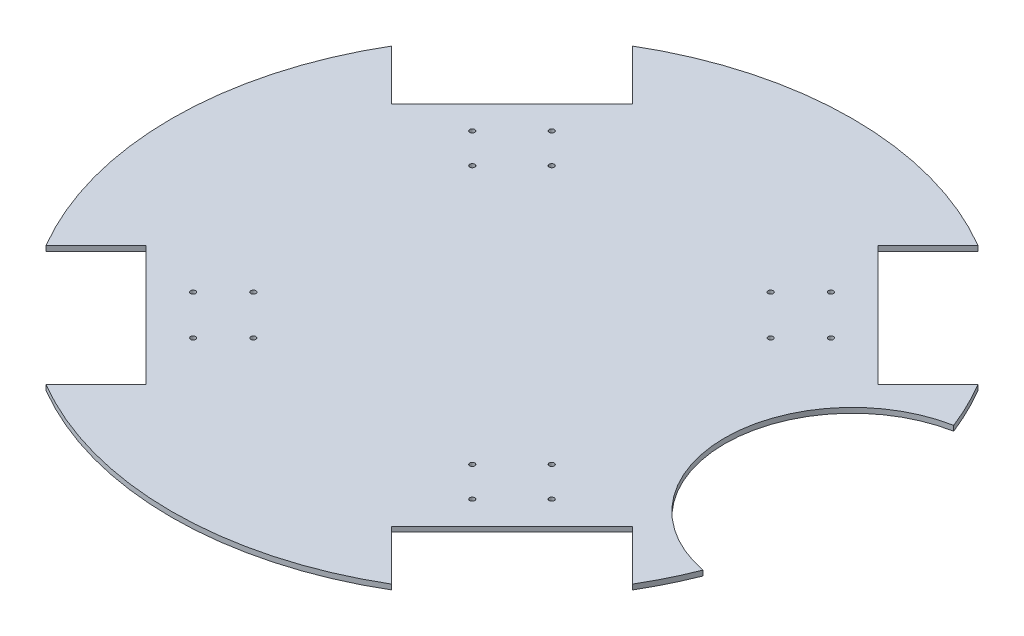
ISO-10303-21;
HEADER;
FILE_DESCRIPTION(('STEP AP214'),'2;1');
FILE_NAME('part.step','',(''),(''),'','','');
FILE_SCHEMA(('AUTOMOTIVE_DESIGN { 1 0 10303 214 1 1 1 1 }'));
ENDSEC;
DATA;
#1=APPLICATION_CONTEXT('core data for automotive mechanical design processes');
#2=APPLICATION_PROTOCOL_DEFINITION('international standard','automotive_design',2000,#1);
#3=PRODUCT_CONTEXT('',#1,'mechanical');
#4=PRODUCT('Part','Part','',(#3));
#5=PRODUCT_RELATED_PRODUCT_CATEGORY('part','',(#4));
#6=PRODUCT_DEFINITION_FORMATION('','',#4);
#7=PRODUCT_DEFINITION_CONTEXT('part definition',#1,'design');
#8=PRODUCT_DEFINITION('design','',#6,#7);
#9=PRODUCT_DEFINITION_SHAPE('','',#8);
#10=(LENGTH_UNIT() NAMED_UNIT(*) SI_UNIT(.MILLI.,.METRE.));
#11=(NAMED_UNIT(*) PLANE_ANGLE_UNIT() SI_UNIT($,.RADIAN.));
#12=(NAMED_UNIT(*) SI_UNIT($,.STERADIAN.) SOLID_ANGLE_UNIT());
#13=UNCERTAINTY_MEASURE_WITH_UNIT(LENGTH_MEASURE(1.E-05),#10,'distance_accuracy_value','');
#14=(GEOMETRIC_REPRESENTATION_CONTEXT(3) GLOBAL_UNCERTAINTY_ASSIGNED_CONTEXT((#13)) GLOBAL_UNIT_ASSIGNED_CONTEXT((#10,
#11,#12)) REPRESENTATION_CONTEXT('',''));
#15=CARTESIAN_POINT('',(0.,0.,0.));
#16=DIRECTION('',(0.,0.,1.));
#17=DIRECTION('',(1.,0.,0.));
#18=AXIS2_PLACEMENT_3D('',#15,#16,#17);
#19=CARTESIAN_POINT('',(0.,3.,0.));
#20=DIRECTION('',(0.,-1.,0.));
#21=DIRECTION('',(0.,0.,-1.));
#22=AXIS2_PLACEMENT_3D('',#19,#20,#21);
#23=CYLINDRICAL_SURFACE('',#22,200.);
#24=CARTESIAN_POINT('',(0.,0.,0.));
#25=DIRECTION('',(0.,1.,0.));
#26=DIRECTION('',(0.,0.,1.));
#27=AXIS2_PLACEMENT_3D('',#24,#25,#26);
#28=CIRCLE('',#27,200.);
#29=CARTESIAN_POINT('',(172.285978435621,0.,101.57530031696));
#30=VERTEX_POINT('',#29);
#31=CARTESIAN_POINT('',(185.9375,0.,73.6698452132894));
#32=VERTEX_POINT('',#31);
#33=EDGE_CURVE('E204',#30,#32,#28,.T.);
#34=ORIENTED_EDGE('',*,*,#33,.T.);
#35=DIRECTION('',(0.,1.,0.));
#36=VECTOR('',#35,1.);
#37=CARTESIAN_POINT('',(185.9375,-2.,73.6698452132893));
#38=LINE('',#37,#36);
#39=CARTESIAN_POINT('',(185.9375,3.,73.6698452132893));
#40=VERTEX_POINT('',#39);
#41=EDGE_CURVE('E57',#32,#40,#38,.T.);
#42=ORIENTED_EDGE('',*,*,#41,.T.);
#43=CARTESIAN_POINT('',(0.,3.,0.));
#44=DIRECTION('',(0.,1.,0.));
#45=DIRECTION('',(0.,0.,1.));
#46=AXIS2_PLACEMENT_3D('',#43,#44,#45);
#47=CIRCLE('',#46,200.);
#48=CARTESIAN_POINT('',(172.285978435621,3.,101.57530031696));
#49=VERTEX_POINT('',#48);
#50=EDGE_CURVE('E182',#49,#40,#47,.T.);
#51=ORIENTED_EDGE('',*,*,#50,.F.);
#52=DIRECTION('',(0.,-1.,0.));
#53=VECTOR('',#52,1.);
#54=CARTESIAN_POINT('',(172.285978435621,3.,101.57530031696));
#55=LINE('',#54,#53);
#56=EDGE_CURVE('E291',#49,#30,#55,.T.);
#57=ORIENTED_EDGE('',*,*,#56,.T.);
#58=EDGE_LOOP('',(#34,#42,#51,#57));
#59=FACE_BOUND('',#58,.T.);
#60=ADVANCED_FACE('F39',(#59),#23,.T.);
#61=CARTESIAN_POINT('',(-101.575300316964,0.,172.285978435619));
#62=VERTEX_POINT('',#61);
#63=CARTESIAN_POINT('',(101.575300316968,0.,172.285978435616));
#64=VERTEX_POINT('',#63);
#65=EDGE_CURVE('E211',#62,#64,#28,.T.);
#66=ORIENTED_EDGE('',*,*,#65,.T.);
#67=DIRECTION('',(0.,-1.,0.));
#68=VECTOR('',#67,1.);
#69=CARTESIAN_POINT('',(101.575300316968,3.,172.285978435616));
#70=LINE('',#69,#68);
#71=CARTESIAN_POINT('',(101.575300316968,3.,172.285978435616));
#72=VERTEX_POINT('',#71);
#73=EDGE_CURVE('E221',#64,#72,#70,.F.);
#74=ORIENTED_EDGE('',*,*,#73,.T.);
#75=CARTESIAN_POINT('',(-101.575300316964,3.,172.285978435619));
#76=VERTEX_POINT('',#75);
#77=EDGE_CURVE('E193',#76,#72,#47,.T.);
#78=ORIENTED_EDGE('',*,*,#77,.F.);
#79=DIRECTION('',(0.,-1.,0.));
#80=VECTOR('',#79,1.);
#81=CARTESIAN_POINT('',(-101.575300316964,3.,172.285978435619));
#82=LINE('',#81,#80);
#83=EDGE_CURVE('E272',#76,#62,#82,.T.);
#84=ORIENTED_EDGE('',*,*,#83,.T.);
#85=EDGE_LOOP('',(#66,#74,#78,#84));
#86=FACE_BOUND('',#85,.T.);
#87=ADVANCED_FACE('F296',(#86),#23,.T.);
#88=CARTESIAN_POINT('',(185.9375,3.,-73.6698452132893));
#89=VERTEX_POINT('',#88);
#90=CARTESIAN_POINT('',(172.285978435617,3.,-101.575300316968));
#91=VERTEX_POINT('',#90);
#92=EDGE_CURVE('E178',#89,#91,#47,.T.);
#93=ORIENTED_EDGE('',*,*,#92,.F.);
#94=DIRECTION('',(0.,1.,0.));
#95=VECTOR('',#94,1.);
#96=CARTESIAN_POINT('',(185.9375,-2.,-73.6698452132893));
#97=LINE('',#96,#95);
#98=CARTESIAN_POINT('',(185.9375,0.,-73.6698452132894));
#99=VERTEX_POINT('',#98);
#100=EDGE_CURVE('E165',#89,#99,#97,.F.);
#101=ORIENTED_EDGE('',*,*,#100,.T.);
#102=CARTESIAN_POINT('',(172.285978435617,0.,-101.575300316968));
#103=VERTEX_POINT('',#102);
#104=EDGE_CURVE('E210',#99,#103,#28,.T.);
#105=ORIENTED_EDGE('',*,*,#104,.T.);
#106=DIRECTION('',(0.,-1.,0.));
#107=VECTOR('',#106,1.);
#108=CARTESIAN_POINT('',(172.285978435616,3.,-101.575300316968));
#109=LINE('',#108,#107);
#110=EDGE_CURVE('E188',#103,#91,#109,.F.);
#111=ORIENTED_EDGE('',*,*,#110,.T.);
#112=EDGE_LOOP('',(#93,#101,#105,#111));
#113=FACE_BOUND('',#112,.T.);
#114=ADVANCED_FACE('F186',(#113),#23,.T.);
#115=CARTESIAN_POINT('',(101.57530031696,3.,-172.285978435621));
#116=VERTEX_POINT('',#115);
#117=CARTESIAN_POINT('',(-101.575300316968,3.,-172.285978435617));
#118=VERTEX_POINT('',#117);
#119=EDGE_CURVE('E190',#116,#118,#47,.T.);
#120=ORIENTED_EDGE('',*,*,#119,.F.);
#121=DIRECTION('',(0.,-1.,0.));
#122=VECTOR('',#121,1.);
#123=CARTESIAN_POINT('',(101.57530031696,3.,-172.285978435621));
#124=LINE('',#123,#122);
#125=CARTESIAN_POINT('',(101.57530031696,0.,-172.285978435621));
#126=VERTEX_POINT('',#125);
#127=EDGE_CURVE('E286',#116,#126,#124,.T.);
#128=ORIENTED_EDGE('',*,*,#127,.T.);
#129=CARTESIAN_POINT('',(-101.575300316968,0.,-172.285978435617));
#130=VERTEX_POINT('',#129);
#131=EDGE_CURVE('E212',#126,#130,#28,.T.);
#132=ORIENTED_EDGE('',*,*,#131,.T.);
#133=DIRECTION('',(0.,-1.,0.));
#134=VECTOR('',#133,1.);
#135=CARTESIAN_POINT('',(-101.575300316968,3.,-172.285978435616));
#136=LINE('',#135,#134);
#137=EDGE_CURVE('E283',#130,#118,#136,.F.);
#138=ORIENTED_EDGE('',*,*,#137,.T.);
#139=EDGE_LOOP('',(#120,#128,#132,#138));
#140=FACE_BOUND('',#139,.T.);
#141=ADVANCED_FACE('F477',(#140),#23,.T.);
#142=CARTESIAN_POINT('',(-172.285978435621,3.,-101.57530031696));
#143=VERTEX_POINT('',#142);
#144=CARTESIAN_POINT('',(-172.285978435616,3.,101.575300316968));
#145=VERTEX_POINT('',#144);
#146=EDGE_CURVE('E192',#143,#145,#47,.T.);
#147=ORIENTED_EDGE('',*,*,#146,.F.);
#148=DIRECTION('',(0.,-1.,0.));
#149=VECTOR('',#148,1.);
#150=CARTESIAN_POINT('',(-172.285978435621,3.,-101.57530031696));
#151=LINE('',#150,#149);
#152=CARTESIAN_POINT('',(-172.285978435621,0.,-101.57530031696));
#153=VERTEX_POINT('',#152);
#154=EDGE_CURVE('E236',#143,#153,#151,.T.);
#155=ORIENTED_EDGE('',*,*,#154,.T.);
#156=CARTESIAN_POINT('',(-172.285978435616,0.,101.575300316968));
#157=VERTEX_POINT('',#156);
#158=EDGE_CURVE('E217',#153,#157,#28,.T.);
#159=ORIENTED_EDGE('',*,*,#158,.T.);
#160=DIRECTION('',(0.,-1.,0.));
#161=VECTOR('',#160,1.);
#162=CARTESIAN_POINT('',(-172.285978435616,3.,101.575300316968));
#163=LINE('',#162,#161);
#164=EDGE_CURVE('E235',#157,#145,#163,.F.);
#165=ORIENTED_EDGE('',*,*,#164,.T.);
#166=EDGE_LOOP('',(#147,#155,#159,#165));
#167=FACE_BOUND('',#166,.T.);
#168=ADVANCED_FACE('F41',(#167),#23,.T.);
#169=CARTESIAN_POINT('',(0.,3.,0.));
#170=DIRECTION('',(0.,1.,0.));
#171=DIRECTION('',(0.,0.,1.));
#172=AXIS2_PLACEMENT_3D('',#169,#170,#171);
#173=PLANE('',#172);
#174=CARTESIAN_POINT('',(-87.6741697993176,3.,64.3396460201655));
#175=DIRECTION('',(0.,1.,0.));
#176=DIRECTION('',(0.,0.,-1.));
#177=AXIS2_PLACEMENT_3D('',#174,#175,#176);
#178=CIRCLE('',#177,1.49999999999982);
#179=CARTESIAN_POINT('',(-87.6741697993176,3.,62.8396460201657));
#180=VERTEX_POINT('',#179);
#181=EDGE_CURVE('E851',#180,#180,#178,.T.);
#182=ORIENTED_EDGE('',*,*,#181,.F.);
#183=EDGE_LOOP('',(#182));
#184=FACE_BOUND('',#183,.T.);
#185=CARTESIAN_POINT('',(-82.031457685448,3.,105.365981464609));
#186=DIRECTION('',(0.,1.,0.));
#187=DIRECTION('',(0.,0.,-1.));
#188=AXIS2_PLACEMENT_3D('',#185,#186,#187);
#189=CIRCLE('',#188,1.49999999999984);
#190=CARTESIAN_POINT('',(-82.031457685448,3.,103.865981464609));
#191=VERTEX_POINT('',#190);
#192=EDGE_CURVE('E845',#191,#191,#189,.T.);
#193=ORIENTED_EDGE('',*,*,#192,.F.);
#194=EDGE_LOOP('',(#193));
#195=FACE_BOUND('',#194,.T.);
#196=CARTESIAN_POINT('',(-64.3396460201612,3.,87.6741697993208));
#197=DIRECTION('',(0.,1.,0.));
#198=DIRECTION('',(0.,0.,1.));
#199=AXIS2_PLACEMENT_3D('',#196,#197,#198);
#200=CIRCLE('',#199,1.49999999999982);
#201=CARTESIAN_POINT('',(-64.3396460201612,3.,89.1741697993206));
#202=VERTEX_POINT('',#201);
#203=EDGE_CURVE('E801',#202,#202,#200,.T.);
#204=ORIENTED_EDGE('',*,*,#203,.F.);
#205=EDGE_LOOP('',(#204));
#206=FACE_BOUND('',#205,.T.);
#207=CARTESIAN_POINT('',(-82.0314576854529,3.,-105.365981464605));
#208=DIRECTION('',(0.,1.,0.));
#209=DIRECTION('',(0.,0.,1.));
#210=AXIS2_PLACEMENT_3D('',#207,#208,#209);
#211=CIRCLE('',#210,1.49999999999983);
#212=CARTESIAN_POINT('',(-82.0314576854529,3.,-103.865981464605));
#213=VERTEX_POINT('',#212);
#214=EDGE_CURVE('E846',#213,#213,#211,.T.);
#215=ORIENTED_EDGE('',*,*,#214,.F.);
#216=EDGE_LOOP('',(#215));
#217=FACE_BOUND('',#216,.T.);
#218=CARTESIAN_POINT('',(64.3396460201658,3.,87.6741697993173));
#219=DIRECTION('',(0.,1.,0.));
#220=DIRECTION('',(0.,0.,-1.));
#221=AXIS2_PLACEMENT_3D('',#218,#219,#220);
#222=CIRCLE('',#221,1.49999999999982);
#223=CARTESIAN_POINT('',(64.3396460201658,3.,86.1741697993175));
#224=VERTEX_POINT('',#223);
#225=EDGE_CURVE('E871',#224,#224,#222,.T.);
#226=ORIENTED_EDGE('',*,*,#225,.F.);
#227=EDGE_LOOP('',(#226));
#228=FACE_BOUND('',#227,.T.);
#229=CARTESIAN_POINT('',(105.365981464609,3.,82.0314576854477));
#230=DIRECTION('',(0.,1.,0.));
#231=DIRECTION('',(0.,0.,-1.));
#232=AXIS2_PLACEMENT_3D('',#229,#230,#231);
#233=CIRCLE('',#232,1.49999999999984);
#234=CARTESIAN_POINT('',(105.365981464609,3.,80.5314576854478));
#235=VERTEX_POINT('',#234);
#236=EDGE_CURVE('E867',#235,#235,#233,.T.);
#237=ORIENTED_EDGE('',*,*,#236,.F.);
#238=EDGE_LOOP('',(#237));
#239=FACE_BOUND('',#238,.T.);
#240=CARTESIAN_POINT('',(87.674169799321,3.,64.3396460201608));
#241=DIRECTION('',(0.,1.,0.));
#242=DIRECTION('',(0.,0.,1.));
#243=AXIS2_PLACEMENT_3D('',#240,#241,#242);
#244=CIRCLE('',#243,1.49999999999982);
#245=CARTESIAN_POINT('',(87.674169799321,3.,65.8396460201607));
#246=VERTEX_POINT('',#245);
#247=EDGE_CURVE('E863',#246,#246,#244,.T.);
#248=ORIENTED_EDGE('',*,*,#247,.F.);
#249=EDGE_LOOP('',(#248));
#250=FACE_BOUND('',#249,.T.);
#251=CARTESIAN_POINT('',(-105.365981464605,3.,82.0314576854532));
#252=DIRECTION('',(0.,1.,0.));
#253=DIRECTION('',(0.,0.,1.));
#254=AXIS2_PLACEMENT_3D('',#251,#252,#253);
#255=CIRCLE('',#254,1.49999999999985);
#256=CARTESIAN_POINT('',(-105.365981464605,3.,83.5314576854531));
#257=VERTEX_POINT('',#256);
#258=EDGE_CURVE('E861',#257,#257,#255,.T.);
#259=ORIENTED_EDGE('',*,*,#258,.F.);
#260=EDGE_LOOP('',(#259));
#261=FACE_BOUND('',#260,.T.);
#262=CARTESIAN_POINT('',(64.3396460201564,3.,-87.6741697993205));
#263=DIRECTION('',(0.,1.,0.));
#264=DIRECTION('',(0.,0.,1.));
#265=AXIS2_PLACEMENT_3D('',#262,#263,#264);
#266=CIRCLE('',#265,1.49999999999804);
#267=CARTESIAN_POINT('',(64.3396460201564,3.,-86.1741697993225));
#268=VERTEX_POINT('',#267);
#269=EDGE_CURVE('E892',#268,#268,#266,.T.);
#270=ORIENTED_EDGE('',*,*,#269,.F.);
#271=EDGE_LOOP('',(#270));
#272=FACE_BOUND('',#271,.T.);
#273=CARTESIAN_POINT('',(82.0314576854428,3.,-105.365981464609));
#274=DIRECTION('',(0.,1.,0.));
#275=DIRECTION('',(0.,0.,-1.));
#276=AXIS2_PLACEMENT_3D('',#273,#274,#275);
#277=CIRCLE('',#276,1.49999999999741);
#278=CARTESIAN_POINT('',(82.0314576854428,3.,-106.865981464606));
#279=VERTEX_POINT('',#278);
#280=EDGE_CURVE('E896',#279,#279,#277,.T.);
#281=ORIENTED_EDGE('',*,*,#280,.F.);
#282=EDGE_LOOP('',(#281));
#283=FACE_BOUND('',#282,.T.);
#284=CARTESIAN_POINT('',(87.6741697993121,3.,-64.3396460201661));
#285=DIRECTION('',(0.,1.,0.));
#286=DIRECTION('',(0.,0.,-1.));
#287=AXIS2_PLACEMENT_3D('',#284,#285,#286);
#288=CIRCLE('',#287,1.49999999999687);
#289=CARTESIAN_POINT('',(87.6741697993121,3.,-65.839646020163));
#290=VERTEX_POINT('',#289);
#291=EDGE_CURVE('E900',#290,#290,#288,.T.);
#292=ORIENTED_EDGE('',*,*,#291,.F.);
#293=EDGE_LOOP('',(#292));
#294=FACE_BOUND('',#293,.T.);
#295=CARTESIAN_POINT('',(-64.3396460201652,3.,-87.6741697993178));
#296=DIRECTION('',(0.,1.,0.));
#297=DIRECTION('',(0.,0.,-1.));
#298=AXIS2_PLACEMENT_3D('',#295,#296,#297);
#299=CIRCLE('',#298,1.49999999999982);
#300=CARTESIAN_POINT('',(-64.3396460201652,3.,-89.1741697993176));
#301=VERTEX_POINT('',#300);
#302=EDGE_CURVE('E854',#301,#301,#299,.T.);
#303=ORIENTED_EDGE('',*,*,#302,.F.);
#304=EDGE_LOOP('',(#303));
#305=FACE_BOUND('',#304,.T.);
#306=CARTESIAN_POINT('',(-105.365981464608,3.,-82.0314576854484));
#307=DIRECTION('',(0.,1.,0.));
#308=DIRECTION('',(0.,0.,-1.));
#309=AXIS2_PLACEMENT_3D('',#306,#307,#308);
#310=CIRCLE('',#309,1.49999999999983);
#311=CARTESIAN_POINT('',(-105.365981464608,3.,-83.5314576854482));
#312=VERTEX_POINT('',#311);
#313=EDGE_CURVE('E857',#312,#312,#310,.T.);
#314=ORIENTED_EDGE('',*,*,#313,.F.);
#315=EDGE_LOOP('',(#314));
#316=FACE_BOUND('',#315,.T.);
#317=CARTESIAN_POINT('',(-87.6741697993205,3.,-64.3396460201615));
#318=DIRECTION('',(0.,1.,0.));
#319=DIRECTION('',(0.,0.,1.));
#320=AXIS2_PLACEMENT_3D('',#317,#318,#319);
#321=CIRCLE('',#320,1.49999999999982);
#322=CARTESIAN_POINT('',(-87.6741697993205,3.,-62.8396460201616));
#323=VERTEX_POINT('',#322);
#324=EDGE_CURVE('E910',#323,#323,#321,.T.);
#325=ORIENTED_EDGE('',*,*,#324,.F.);
#326=EDGE_LOOP('',(#325));
#327=FACE_BOUND('',#326,.T.);
#328=CARTESIAN_POINT('',(105.365981464599,3.,-82.0314576854536));
#329=DIRECTION('',(0.,1.,0.));
#330=DIRECTION('',(0.,0.,1.));
#331=AXIS2_PLACEMENT_3D('',#328,#329,#330);
#332=CIRCLE('',#331,1.49999999999711);
#333=CARTESIAN_POINT('',(105.365981464599,3.,-80.5314576854565));
#334=VERTEX_POINT('',#333);
#335=EDGE_CURVE('E913',#334,#334,#332,.T.);
#336=ORIENTED_EDGE('',*,*,#335,.F.);
#337=EDGE_LOOP('',(#336));
#338=FACE_BOUND('',#337,.T.);
#339=CARTESIAN_POINT('',(82.0314576854513,3.,105.365981464602));
#340=DIRECTION('',(0.,1.,0.));
#341=DIRECTION('',(0.,0.,1.));
#342=AXIS2_PLACEMENT_3D('',#339,#340,#341);
#343=CIRCLE('',#342,1.50000000000137);
#344=CARTESIAN_POINT('',(82.0314576854513,3.,106.865981464603));
#345=VERTEX_POINT('',#344);
#346=EDGE_CURVE('E398',#345,#345,#343,.T.);
#347=ORIENTED_EDGE('',*,*,#346,.F.);
#348=EDGE_LOOP('',(#347));
#349=FACE_BOUND('',#348,.T.);
#350=CARTESIAN_POINT('',(200.,3.,0.));
#351=DIRECTION('',(0.,1.,0.));
#352=DIRECTION('',(0.,0.,1.));
#353=AXIS2_PLACEMENT_3D('',#350,#351,#352);
#354=CIRCLE('',#353,75.);
#355=EDGE_CURVE('E168',#89,#40,#354,.T.);
#356=ORIENTED_EDGE('',*,*,#355,.F.);
#357=ORIENTED_EDGE('',*,*,#92,.T.);
#358=DIRECTION('',(0.707106781186546,0.,-0.707106781186549));
#359=VECTOR('',#358,1.);
#360=CARTESIAN_POINT('',(142.885155346263,3.,-72.1744772276151));
#361=LINE('',#360,#359);
#362=CARTESIAN_POINT('',(142.885155346263,3.,-72.1744772276151));
#363=VERTEX_POINT('',#362);
#364=EDGE_CURVE('E323',#363,#91,#361,.T.);
#365=ORIENTED_EDGE('',*,*,#364,.F.);
#366=DIRECTION('',(0.707106781186549,0.,0.707106781186546));
#367=VECTOR('',#366,1.);
#368=CARTESIAN_POINT('',(142.885155346263,3.,-72.1744772276151));
#369=LINE('',#368,#367);
#370=CARTESIAN_POINT('',(72.1744772276088,3.,-142.885155346269));
#371=VERTEX_POINT('',#370);
#372=EDGE_CURVE('E363',#371,#363,#369,.T.);
#373=ORIENTED_EDGE('',*,*,#372,.F.);
#374=DIRECTION('',(-0.707106781186546,0.,0.707106781186549));
#375=VECTOR('',#374,1.);
#376=CARTESIAN_POINT('',(72.1744772276088,3.,-142.885155346269));
#377=LINE('',#376,#375);
#378=EDGE_CURVE('E326',#116,#371,#377,.T.);
#379=ORIENTED_EDGE('',*,*,#378,.F.);
#380=ORIENTED_EDGE('',*,*,#119,.T.);
#381=DIRECTION('',(-0.707106781186549,0.,-0.707106781186546));
#382=VECTOR('',#381,1.);
#383=CARTESIAN_POINT('',(-72.1744772276151,3.,-142.885155346263));
#384=LINE('',#383,#382);
#385=CARTESIAN_POINT('',(-72.1744772276151,3.,-142.885155346263));
#386=VERTEX_POINT('',#385);
#387=EDGE_CURVE('E343',#386,#118,#384,.T.);
#388=ORIENTED_EDGE('',*,*,#387,.F.);
#389=DIRECTION('',(0.707106781186546,0.,-0.707106781186549));
#390=VECTOR('',#389,1.);
#391=CARTESIAN_POINT('',(-72.1744772276151,3.,-142.885155346263));
#392=LINE('',#391,#390);
#393=CARTESIAN_POINT('',(-142.885155346269,3.,-72.1744772276088));
#394=VERTEX_POINT('',#393);
#395=EDGE_CURVE('E339',#394,#386,#392,.T.);
#396=ORIENTED_EDGE('',*,*,#395,.F.);
#397=DIRECTION('',(0.707106781186548,0.,0.707106781186546));
#398=VECTOR('',#397,1.);
#399=CARTESIAN_POINT('',(-142.885155346269,3.,-72.1744772276088));
#400=LINE('',#399,#398);
#401=EDGE_CURVE('E346',#143,#394,#400,.T.);
#402=ORIENTED_EDGE('',*,*,#401,.F.);
#403=ORIENTED_EDGE('',*,*,#146,.T.);
#404=DIRECTION('',(-0.707106781186546,0.,0.707106781186549));
#405=VECTOR('',#404,1.);
#406=CARTESIAN_POINT('',(-142.885155346263,3.,72.1744772276151));
#407=LINE('',#406,#405);
#408=CARTESIAN_POINT('',(-142.885155346263,3.,72.1744772276151));
#409=VERTEX_POINT('',#408);
#410=EDGE_CURVE('E263',#409,#145,#407,.T.);
#411=ORIENTED_EDGE('',*,*,#410,.F.);
#412=DIRECTION('',(-0.707106781186549,0.,-0.707106781186546));
#413=VECTOR('',#412,1.);
#414=CARTESIAN_POINT('',(-142.885155346263,3.,72.1744772276151));
#415=LINE('',#414,#413);
#416=CARTESIAN_POINT('',(-72.1744772276115,3.,142.885155346267));
#417=VERTEX_POINT('',#416);
#418=EDGE_CURVE('E250',#417,#409,#415,.T.);
#419=ORIENTED_EDGE('',*,*,#418,.F.);
#420=DIRECTION('',(0.707106781186546,0.,-0.707106781186549));
#421=VECTOR('',#420,1.);
#422=CARTESIAN_POINT('',(-72.1744772276115,3.,142.885155346267));
#423=LINE('',#422,#421);
#424=EDGE_CURVE('E257',#76,#417,#423,.T.);
#425=ORIENTED_EDGE('',*,*,#424,.F.);
#426=ORIENTED_EDGE('',*,*,#77,.T.);
#427=DIRECTION('',(0.707106781186549,0.,0.707106781186546));
#428=VECTOR('',#427,1.);
#429=CARTESIAN_POINT('',(72.1744772276151,3.,142.885155346263));
#430=LINE('',#429,#428);
#431=CARTESIAN_POINT('',(72.1744772276151,3.,142.885155346263));
#432=VERTEX_POINT('',#431);
#433=EDGE_CURVE('E303',#432,#72,#430,.T.);
#434=ORIENTED_EDGE('',*,*,#433,.F.);
#435=DIRECTION('',(-0.707106781186546,0.,0.707106781186549));
#436=VECTOR('',#435,1.);
#437=CARTESIAN_POINT('',(72.1744772276151,3.,142.885155346263));
#438=LINE('',#437,#436);
#439=CARTESIAN_POINT('',(142.885155346269,3.,72.1744772276088));
#440=VERTEX_POINT('',#439);
#441=EDGE_CURVE('E306',#440,#432,#438,.T.);
#442=ORIENTED_EDGE('',*,*,#441,.F.);
#443=DIRECTION('',(-0.707106781186549,0.,-0.707106781186546));
#444=VECTOR('',#443,1.);
#445=CARTESIAN_POINT('',(142.885155346269,3.,72.1744772276088));
#446=LINE('',#445,#444);
#447=EDGE_CURVE('E312',#49,#440,#446,.T.);
#448=ORIENTED_EDGE('',*,*,#447,.F.);
#449=ORIENTED_EDGE('',*,*,#50,.T.);
#450=EDGE_LOOP('',(#356,#357,#365,#373,#379,#380,#388,#396,#402,#403,#411,#419,#425,#426,#434,
#442,#448,#449));
#451=FACE_BOUND('',#450,.T.);
#452=ADVANCED_FACE('F176',(#184,#195,#206,#217,#228,#239,#250,#261,#272,#283,#294,#305,#316,
#327,#338,#349,#451),#173,.T.);
#453=CARTESIAN_POINT('',(0.,0.,0.));
#454=DIRECTION('',(0.,1.,0.));
#455=DIRECTION('',(0.,0.,1.));
#456=AXIS2_PLACEMENT_3D('',#453,#454,#455);
#457=PLANE('',#456);
#458=CARTESIAN_POINT('',(-87.6741697993176,0.,64.3396460201655));
#459=DIRECTION('',(0.,1.,0.));
#460=DIRECTION('',(0.,0.,1.));
#461=AXIS2_PLACEMENT_3D('',#458,#459,#460);
#462=CIRCLE('',#461,1.49999999999982);
#463=CARTESIAN_POINT('',(-87.6741697993176,0.,65.8396460201653));
#464=VERTEX_POINT('',#463);
#465=EDGE_CURVE('E43',#464,#464,#462,.T.);
#466=ORIENTED_EDGE('',*,*,#465,.T.);
#467=EDGE_LOOP('',(#466));
#468=FACE_BOUND('',#467,.T.);
#469=CARTESIAN_POINT('',(-82.031457685448,0.,105.365981464609));
#470=DIRECTION('',(0.,1.,0.));
#471=DIRECTION('',(0.,0.,1.));
#472=AXIS2_PLACEMENT_3D('',#469,#470,#471);
#473=CIRCLE('',#472,1.49999999999984);
#474=CARTESIAN_POINT('',(-82.031457685448,0.,106.865981464609));
#475=VERTEX_POINT('',#474);
#476=EDGE_CURVE('E449',#475,#475,#473,.T.);
#477=ORIENTED_EDGE('',*,*,#476,.T.);
#478=EDGE_LOOP('',(#477));
#479=FACE_BOUND('',#478,.T.);
#480=CARTESIAN_POINT('',(-64.3396460201612,0.,87.6741697993208));
#481=DIRECTION('',(0.,1.,0.));
#482=DIRECTION('',(0.,0.,1.));
#483=AXIS2_PLACEMENT_3D('',#480,#481,#482);
#484=CIRCLE('',#483,1.49999999999982);
#485=CARTESIAN_POINT('',(-64.3396460201612,0.,89.1741697993206));
#486=VERTEX_POINT('',#485);
#487=EDGE_CURVE('E446',#486,#486,#484,.T.);
#488=ORIENTED_EDGE('',*,*,#487,.T.);
#489=EDGE_LOOP('',(#488));
#490=FACE_BOUND('',#489,.T.);
#491=CARTESIAN_POINT('',(-82.0314576854529,0.,-105.365981464605));
#492=DIRECTION('',(0.,1.,0.));
#493=DIRECTION('',(0.,0.,1.));
#494=AXIS2_PLACEMENT_3D('',#491,#492,#493);
#495=CIRCLE('',#494,1.49999999999983);
#496=CARTESIAN_POINT('',(-82.0314576854529,0.,-103.865981464605));
#497=VERTEX_POINT('',#496);
#498=EDGE_CURVE('E442',#497,#497,#495,.T.);
#499=ORIENTED_EDGE('',*,*,#498,.T.);
#500=EDGE_LOOP('',(#499));
#501=FACE_BOUND('',#500,.T.);
#502=CARTESIAN_POINT('',(64.3396460201658,0.,87.6741697993173));
#503=DIRECTION('',(0.,1.,0.));
#504=DIRECTION('',(0.,0.,1.));
#505=AXIS2_PLACEMENT_3D('',#502,#503,#504);
#506=CIRCLE('',#505,1.49999999999982);
#507=CARTESIAN_POINT('',(64.3396460201658,0.,89.1741697993172));
#508=VERTEX_POINT('',#507);
#509=EDGE_CURVE('E438',#508,#508,#506,.T.);
#510=ORIENTED_EDGE('',*,*,#509,.T.);
#511=EDGE_LOOP('',(#510));
#512=FACE_BOUND('',#511,.T.);
#513=CARTESIAN_POINT('',(105.365981464609,0.,82.0314576854477));
#514=DIRECTION('',(0.,1.,0.));
#515=DIRECTION('',(0.,0.,1.));
#516=AXIS2_PLACEMENT_3D('',#513,#514,#515);
#517=CIRCLE('',#516,1.49999999999984);
#518=CARTESIAN_POINT('',(105.365981464609,0.,83.5314576854475));
#519=VERTEX_POINT('',#518);
#520=EDGE_CURVE('E434',#519,#519,#517,.T.);
#521=ORIENTED_EDGE('',*,*,#520,.T.);
#522=EDGE_LOOP('',(#521));
#523=FACE_BOUND('',#522,.T.);
#524=CARTESIAN_POINT('',(87.674169799321,0.,64.3396460201608));
#525=DIRECTION('',(0.,1.,0.));
#526=DIRECTION('',(0.,0.,1.));
#527=AXIS2_PLACEMENT_3D('',#524,#525,#526);
#528=CIRCLE('',#527,1.49999999999982);
#529=CARTESIAN_POINT('',(87.674169799321,0.,65.8396460201607));
#530=VERTEX_POINT('',#529);
#531=EDGE_CURVE('E430',#530,#530,#528,.T.);
#532=ORIENTED_EDGE('',*,*,#531,.T.);
#533=EDGE_LOOP('',(#532));
#534=FACE_BOUND('',#533,.T.);
#535=CARTESIAN_POINT('',(-105.365981464605,0.,82.0314576854532));
#536=DIRECTION('',(0.,1.,0.));
#537=DIRECTION('',(0.,0.,1.));
#538=AXIS2_PLACEMENT_3D('',#535,#536,#537);
#539=CIRCLE('',#538,1.49999999999985);
#540=CARTESIAN_POINT('',(-105.365981464605,0.,83.5314576854531));
#541=VERTEX_POINT('',#540);
#542=EDGE_CURVE('E426',#541,#541,#539,.T.);
#543=ORIENTED_EDGE('',*,*,#542,.T.);
#544=EDGE_LOOP('',(#543));
#545=FACE_BOUND('',#544,.T.);
#546=CARTESIAN_POINT('',(64.3396460201564,0.,-87.6741697993205));
#547=DIRECTION('',(0.,1.,0.));
#548=DIRECTION('',(0.,0.,1.));
#549=AXIS2_PLACEMENT_3D('',#546,#547,#548);
#550=CIRCLE('',#549,1.49999999999804);
#551=CARTESIAN_POINT('',(64.3396460201564,0.,-86.1741697993225));
#552=VERTEX_POINT('',#551);
#553=EDGE_CURVE('E422',#552,#552,#550,.T.);
#554=ORIENTED_EDGE('',*,*,#553,.T.);
#555=EDGE_LOOP('',(#554));
#556=FACE_BOUND('',#555,.T.);
#557=CARTESIAN_POINT('',(82.0314576854428,0.,-105.365981464609));
#558=DIRECTION('',(0.,1.,0.));
#559=DIRECTION('',(0.,0.,1.));
#560=AXIS2_PLACEMENT_3D('',#557,#558,#559);
#561=CIRCLE('',#560,1.49999999999741);
#562=CARTESIAN_POINT('',(82.0314576854428,0.,-103.865981464611));
#563=VERTEX_POINT('',#562);
#564=EDGE_CURVE('E418',#563,#563,#561,.T.);
#565=ORIENTED_EDGE('',*,*,#564,.T.);
#566=EDGE_LOOP('',(#565));
#567=FACE_BOUND('',#566,.T.);
#568=CARTESIAN_POINT('',(87.6741697993121,0.,-64.3396460201661));
#569=DIRECTION('',(0.,1.,0.));
#570=DIRECTION('',(0.,0.,1.));
#571=AXIS2_PLACEMENT_3D('',#568,#569,#570);
#572=CIRCLE('',#571,1.49999999999687);
#573=CARTESIAN_POINT('',(87.6741697993121,0.,-62.8396460201693));
#574=VERTEX_POINT('',#573);
#575=EDGE_CURVE('E414',#574,#574,#572,.T.);
#576=ORIENTED_EDGE('',*,*,#575,.T.);
#577=EDGE_LOOP('',(#576));
#578=FACE_BOUND('',#577,.T.);
#579=CARTESIAN_POINT('',(-64.3396460201652,0.,-87.6741697993178));
#580=DIRECTION('',(0.,1.,0.));
#581=DIRECTION('',(0.,0.,1.));
#582=AXIS2_PLACEMENT_3D('',#579,#580,#581);
#583=CIRCLE('',#582,1.49999999999982);
#584=CARTESIAN_POINT('',(-64.3396460201652,0.,-86.174169799318));
#585=VERTEX_POINT('',#584);
#586=EDGE_CURVE('E410',#585,#585,#583,.T.);
#587=ORIENTED_EDGE('',*,*,#586,.T.);
#588=EDGE_LOOP('',(#587));
#589=FACE_BOUND('',#588,.T.);
#590=CARTESIAN_POINT('',(-105.365981464608,0.,-82.0314576854484));
#591=DIRECTION('',(0.,1.,0.));
#592=DIRECTION('',(0.,0.,1.));
#593=AXIS2_PLACEMENT_3D('',#590,#591,#592);
#594=CIRCLE('',#593,1.49999999999983);
#595=CARTESIAN_POINT('',(-105.365981464608,0.,-80.5314576854486));
#596=VERTEX_POINT('',#595);
#597=EDGE_CURVE('E406',#596,#596,#594,.T.);
#598=ORIENTED_EDGE('',*,*,#597,.T.);
#599=EDGE_LOOP('',(#598));
#600=FACE_BOUND('',#599,.T.);
#601=CARTESIAN_POINT('',(-87.6741697993205,0.,-64.3396460201615));
#602=DIRECTION('',(0.,1.,0.));
#603=DIRECTION('',(0.,0.,1.));
#604=AXIS2_PLACEMENT_3D('',#601,#602,#603);
#605=CIRCLE('',#604,1.49999999999982);
#606=CARTESIAN_POINT('',(-87.6741697993205,0.,-62.8396460201616));
#607=VERTEX_POINT('',#606);
#608=EDGE_CURVE('E402',#607,#607,#605,.T.);
#609=ORIENTED_EDGE('',*,*,#608,.T.);
#610=EDGE_LOOP('',(#609));
#611=FACE_BOUND('',#610,.T.);
#612=CARTESIAN_POINT('',(105.365981464599,0.,-82.0314576854536));
#613=DIRECTION('',(0.,1.,0.));
#614=DIRECTION('',(0.,0.,1.));
#615=AXIS2_PLACEMENT_3D('',#612,#613,#614);
#616=CIRCLE('',#615,1.49999999999711);
#617=CARTESIAN_POINT('',(105.365981464599,0.,-80.5314576854565));
#618=VERTEX_POINT('',#617);
#619=EDGE_CURVE('E397',#618,#618,#616,.T.);
#620=ORIENTED_EDGE('',*,*,#619,.T.);
#621=EDGE_LOOP('',(#620));
#622=FACE_BOUND('',#621,.T.);
#623=CARTESIAN_POINT('',(82.0314576854513,0.,105.365981464602));
#624=DIRECTION('',(0.,1.,0.));
#625=DIRECTION('',(0.,0.,1.));
#626=AXIS2_PLACEMENT_3D('',#623,#624,#625);
#627=CIRCLE('',#626,1.50000000000137);
#628=CARTESIAN_POINT('',(82.0314576854513,0.,106.865981464603));
#629=VERTEX_POINT('',#628);
#630=EDGE_CURVE('E393',#629,#629,#627,.T.);
#631=ORIENTED_EDGE('',*,*,#630,.T.);
#632=EDGE_LOOP('',(#631));
#633=FACE_BOUND('',#632,.T.);
#634=ORIENTED_EDGE('',*,*,#104,.F.);
#635=CARTESIAN_POINT('',(200.,0.,0.));
#636=DIRECTION('',(0.,1.,0.));
#637=DIRECTION('',(0.,0.,1.));
#638=AXIS2_PLACEMENT_3D('',#635,#636,#637);
#639=CIRCLE('',#638,75.);
#640=EDGE_CURVE('E11',#99,#32,#639,.T.);
#641=ORIENTED_EDGE('',*,*,#640,.T.);
#642=ORIENTED_EDGE('',*,*,#33,.F.);
#643=DIRECTION('',(-0.707106781186549,0.,-0.707106781186546));
#644=VECTOR('',#643,1.);
#645=CARTESIAN_POINT('',(35.35533905933,0.,-35.3553390593302));
#646=LINE('',#645,#644);
#647=CARTESIAN_POINT('',(142.885155346269,0.,72.1744772276088));
#648=VERTEX_POINT('',#647);
#649=EDGE_CURVE('E49',#30,#648,#646,.T.);
#650=ORIENTED_EDGE('',*,*,#649,.T.);
#651=DIRECTION('',(-0.707106781186546,0.,0.707106781186549));
#652=VECTOR('',#651,1.);
#653=CARTESIAN_POINT('',(72.1744772276151,0.,142.885155346263));
#654=LINE('',#653,#652);
#655=CARTESIAN_POINT('',(72.1744772276151,0.,142.885155346263));
#656=VERTEX_POINT('',#655);
#657=EDGE_CURVE('E64',#648,#656,#654,.T.);
#658=ORIENTED_EDGE('',*,*,#657,.T.);
#659=DIRECTION('',(0.707106781186549,0.,0.707106781186546));
#660=VECTOR('',#659,1.);
#661=CARTESIAN_POINT('',(72.1744772276151,0.,142.885155346263));
#662=LINE('',#661,#660);
#663=EDGE_CURVE('E302',#656,#64,#662,.T.);
#664=ORIENTED_EDGE('',*,*,#663,.T.);
#665=ORIENTED_EDGE('',*,*,#65,.F.);
#666=DIRECTION('',(0.707106781186546,0.,-0.707106781186549));
#667=VECTOR('',#666,1.);
#668=CARTESIAN_POINT('',(35.3553390593275,0.,35.3553390593273));
#669=LINE('',#668,#667);
#670=CARTESIAN_POINT('',(-72.1744772276115,0.,142.885155346267));
#671=VERTEX_POINT('',#670);
#672=EDGE_CURVE('E196',#62,#671,#669,.T.);
#673=ORIENTED_EDGE('',*,*,#672,.T.);
#674=DIRECTION('',(-0.707106781186549,0.,-0.707106781186546));
#675=VECTOR('',#674,1.);
#676=CARTESIAN_POINT('',(-142.885155346263,0.,72.1744772276151));
#677=LINE('',#676,#675);
#678=CARTESIAN_POINT('',(-142.885155346263,0.,72.1744772276151));
#679=VERTEX_POINT('',#678);
#680=EDGE_CURVE('E247',#671,#679,#677,.T.);
#681=ORIENTED_EDGE('',*,*,#680,.T.);
#682=DIRECTION('',(-0.707106781186546,0.,0.707106781186549));
#683=VECTOR('',#682,1.);
#684=CARTESIAN_POINT('',(-142.885155346263,0.,72.1744772276151));
#685=LINE('',#684,#683);
#686=EDGE_CURVE('E245',#679,#157,#685,.T.);
#687=ORIENTED_EDGE('',*,*,#686,.T.);
#688=ORIENTED_EDGE('',*,*,#158,.F.);
#689=DIRECTION('',(0.707106781186549,0.,0.707106781186547));
#690=VECTOR('',#689,1.);
#691=CARTESIAN_POINT('',(-35.3553390593301,0.,35.3553390593302));
#692=LINE('',#691,#690);
#693=CARTESIAN_POINT('',(-142.885155346269,0.,-72.1744772276088));
#694=VERTEX_POINT('',#693);
#695=EDGE_CURVE('E242',#153,#694,#692,.T.);
#696=ORIENTED_EDGE('',*,*,#695,.T.);
#697=DIRECTION('',(0.707106781186546,0.,-0.707106781186549));
#698=VECTOR('',#697,1.);
#699=CARTESIAN_POINT('',(-72.1744772276151,0.,-142.885155346263));
#700=LINE('',#699,#698);
#701=CARTESIAN_POINT('',(-72.1744772276151,0.,-142.885155346263));
#702=VERTEX_POINT('',#701);
#703=EDGE_CURVE('E338',#694,#702,#700,.T.);
#704=ORIENTED_EDGE('',*,*,#703,.T.);
#705=DIRECTION('',(-0.707106781186549,0.,-0.707106781186546));
#706=VECTOR('',#705,1.);
#707=CARTESIAN_POINT('',(-72.1744772276151,0.,-142.885155346263));
#708=LINE('',#707,#706);
#709=EDGE_CURVE('E334',#702,#130,#708,.T.);
#710=ORIENTED_EDGE('',*,*,#709,.T.);
#711=ORIENTED_EDGE('',*,*,#131,.F.);
#712=DIRECTION('',(-0.707106781186546,0.,0.707106781186549));
#713=VECTOR('',#712,1.);
#714=CARTESIAN_POINT('',(-35.3553390593301,0.,-35.35533905933));
#715=LINE('',#714,#713);
#716=CARTESIAN_POINT('',(72.1744772276089,0.,-142.885155346269));
#717=VERTEX_POINT('',#716);
#718=EDGE_CURVE('E385',#126,#717,#715,.T.);
#719=ORIENTED_EDGE('',*,*,#718,.T.);
#720=DIRECTION('',(0.707106781186549,0.,0.707106781186546));
#721=VECTOR('',#720,1.);
#722=CARTESIAN_POINT('',(142.885155346263,0.,-72.1744772276151));
#723=LINE('',#722,#721);
#724=CARTESIAN_POINT('',(142.885155346263,0.,-72.1744772276151));
#725=VERTEX_POINT('',#724);
#726=EDGE_CURVE('E362',#717,#725,#723,.T.);
#727=ORIENTED_EDGE('',*,*,#726,.T.);
#728=DIRECTION('',(0.707106781186546,0.,-0.707106781186549));
#729=VECTOR('',#728,1.);
#730=CARTESIAN_POINT('',(142.885155346263,0.,-72.1744772276151));
#731=LINE('',#730,#729);
#732=EDGE_CURVE('E358',#725,#103,#731,.T.);
#733=ORIENTED_EDGE('',*,*,#732,.T.);
#734=EDGE_LOOP('',(#634,#641,#642,#650,#658,#664,#665,#673,#681,#687,#688,#696,#704,#710,#711,
#719,#727,#733));
#735=FACE_BOUND('',#734,.T.);
#736=ADVANCED_FACE('F240',(#468,#479,#490,#501,#512,#523,#534,#545,#556,#567,#578,#589,#600,
#611,#622,#633,#735),#457,.F.);
#737=CARTESIAN_POINT('',(-142.885155346263,0.,72.1744772276151));
#738=DIRECTION('',(-0.707106781186549,0.,-0.707106781186546));
#739=DIRECTION('',(-0.707106781186546,0.,0.707106781186549));
#740=AXIS2_PLACEMENT_3D('',#737,#738,#739);
#741=PLANE('',#740);
#742=ORIENTED_EDGE('',*,*,#686,.F.);
#743=DIRECTION('',(0.,1.,0.));
#744=VECTOR('',#743,1.);
#745=CARTESIAN_POINT('',(-142.885155346263,0.,72.1744772276151));
#746=LINE('',#745,#744);
#747=EDGE_CURVE('E269',#679,#409,#746,.T.);
#748=ORIENTED_EDGE('',*,*,#747,.T.);
#749=ORIENTED_EDGE('',*,*,#410,.T.);
#750=ORIENTED_EDGE('',*,*,#164,.F.);
#751=EDGE_LOOP('',(#742,#748,#749,#750));
#752=FACE_BOUND('',#751,.T.);
#753=ADVANCED_FACE('F500',(#752),#741,.F.);
#754=CARTESIAN_POINT('',(-72.1744772276115,0.,142.885155346267));
#755=DIRECTION('',(0.707106781186549,0.,0.707106781186546));
#756=DIRECTION('',(0.707106781186546,0.,-0.707106781186549));
#757=AXIS2_PLACEMENT_3D('',#754,#755,#756);
#758=PLANE('',#757);
#759=ORIENTED_EDGE('',*,*,#424,.T.);
#760=DIRECTION('',(0.,1.,0.));
#761=VECTOR('',#760,1.);
#762=CARTESIAN_POINT('',(-72.1744772276115,0.,142.885155346267));
#763=LINE('',#762,#761);
#764=EDGE_CURVE('E254',#671,#417,#763,.T.);
#765=ORIENTED_EDGE('',*,*,#764,.F.);
#766=ORIENTED_EDGE('',*,*,#672,.F.);
#767=ORIENTED_EDGE('',*,*,#83,.F.);
#768=EDGE_LOOP('',(#759,#765,#766,#767));
#769=FACE_BOUND('',#768,.T.);
#770=ADVANCED_FACE('F505',(#769),#758,.F.);
#771=CARTESIAN_POINT('',(-142.885155346263,0.,72.1744772276151));
#772=DIRECTION('',(0.707106781186546,0.,-0.707106781186549));
#773=DIRECTION('',(-0.707106781186549,0.,-0.707106781186546));
#774=AXIS2_PLACEMENT_3D('',#771,#772,#773);
#775=PLANE('',#774);
#776=ORIENTED_EDGE('',*,*,#418,.T.);
#777=ORIENTED_EDGE('',*,*,#747,.F.);
#778=ORIENTED_EDGE('',*,*,#680,.F.);
#779=ORIENTED_EDGE('',*,*,#764,.T.);
#780=EDGE_LOOP('',(#776,#777,#778,#779));
#781=FACE_BOUND('',#780,.T.);
#782=ADVANCED_FACE('F502',(#781),#775,.F.);
#783=CARTESIAN_POINT('',(-72.1744772276151,0.,-142.885155346263));
#784=DIRECTION('',(0.707106781186546,0.,-0.707106781186549));
#785=DIRECTION('',(-0.707106781186549,0.,-0.707106781186546));
#786=AXIS2_PLACEMENT_3D('',#783,#784,#785);
#787=PLANE('',#786);
#788=ORIENTED_EDGE('',*,*,#709,.F.);
#789=DIRECTION('',(0.,1.,0.));
#790=VECTOR('',#789,1.);
#791=CARTESIAN_POINT('',(-72.1744772276151,0.,-142.885155346263));
#792=LINE('',#791,#790);
#793=EDGE_CURVE('E266',#702,#386,#792,.T.);
#794=ORIENTED_EDGE('',*,*,#793,.T.);
#795=ORIENTED_EDGE('',*,*,#387,.T.);
#796=ORIENTED_EDGE('',*,*,#137,.F.);
#797=EDGE_LOOP('',(#788,#794,#795,#796));
#798=FACE_BOUND('',#797,.T.);
#799=ADVANCED_FACE('F492',(#798),#787,.F.);
#800=CARTESIAN_POINT('',(-142.885155346269,0.,-72.1744772276088));
#801=DIRECTION('',(-0.707106781186547,0.,0.707106781186549));
#802=DIRECTION('',(0.707106781186549,0.,0.707106781186547));
#803=AXIS2_PLACEMENT_3D('',#800,#801,#802);
#804=PLANE('',#803);
#805=ORIENTED_EDGE('',*,*,#401,.T.);
#806=DIRECTION('',(0.,1.,0.));
#807=VECTOR('',#806,1.);
#808=CARTESIAN_POINT('',(-142.885155346269,0.,-72.1744772276088));
#809=LINE('',#808,#807);
#810=EDGE_CURVE('E342',#694,#394,#809,.T.);
#811=ORIENTED_EDGE('',*,*,#810,.F.);
#812=ORIENTED_EDGE('',*,*,#695,.F.);
#813=ORIENTED_EDGE('',*,*,#154,.F.);
#814=EDGE_LOOP('',(#805,#811,#812,#813));
#815=FACE_BOUND('',#814,.T.);
#816=ADVANCED_FACE('F497',(#815),#804,.F.);
#817=CARTESIAN_POINT('',(-72.1744772276151,0.,-142.885155346263));
#818=DIRECTION('',(0.707106781186549,0.,0.707106781186546));
#819=DIRECTION('',(0.707106781186546,0.,-0.707106781186549));
#820=AXIS2_PLACEMENT_3D('',#817,#818,#819);
#821=PLANE('',#820);
#822=ORIENTED_EDGE('',*,*,#395,.T.);
#823=ORIENTED_EDGE('',*,*,#793,.F.);
#824=ORIENTED_EDGE('',*,*,#703,.F.);
#825=ORIENTED_EDGE('',*,*,#810,.T.);
#826=EDGE_LOOP('',(#822,#823,#824,#825));
#827=FACE_BOUND('',#826,.T.);
#828=ADVANCED_FACE('F494',(#827),#821,.F.);
#829=CARTESIAN_POINT('',(142.885155346263,0.,-72.1744772276151));
#830=DIRECTION('',(0.707106781186549,0.,0.707106781186546));
#831=DIRECTION('',(0.707106781186546,0.,-0.707106781186549));
#832=AXIS2_PLACEMENT_3D('',#829,#830,#831);
#833=PLANE('',#832);
#834=ORIENTED_EDGE('',*,*,#732,.F.);
#835=DIRECTION('',(0.,1.,0.));
#836=VECTOR('',#835,1.);
#837=CARTESIAN_POINT('',(142.885155346263,0.,-72.1744772276151));
#838=LINE('',#837,#836);
#839=EDGE_CURVE('E347',#725,#363,#838,.T.);
#840=ORIENTED_EDGE('',*,*,#839,.T.);
#841=ORIENTED_EDGE('',*,*,#364,.T.);
#842=ORIENTED_EDGE('',*,*,#110,.F.);
#843=EDGE_LOOP('',(#834,#840,#841,#842));
#844=FACE_BOUND('',#843,.T.);
#845=ADVANCED_FACE('F384',(#844),#833,.F.);
#846=CARTESIAN_POINT('',(72.1744772276088,0.,-142.885155346269));
#847=DIRECTION('',(-0.707106781186549,0.,-0.707106781186546));
#848=DIRECTION('',(-0.707106781186546,0.,0.707106781186549));
#849=AXIS2_PLACEMENT_3D('',#846,#847,#848);
#850=PLANE('',#849);
#851=ORIENTED_EDGE('',*,*,#378,.T.);
#852=DIRECTION('',(0.,1.,0.));
#853=VECTOR('',#852,1.);
#854=CARTESIAN_POINT('',(72.1744772276088,0.,-142.885155346269));
#855=LINE('',#854,#853);
#856=EDGE_CURVE('E315',#717,#371,#855,.T.);
#857=ORIENTED_EDGE('',*,*,#856,.F.);
#858=ORIENTED_EDGE('',*,*,#718,.F.);
#859=ORIENTED_EDGE('',*,*,#127,.F.);
#860=EDGE_LOOP('',(#851,#857,#858,#859));
#861=FACE_BOUND('',#860,.T.);
#862=ADVANCED_FACE('F572',(#861),#850,.F.);
#863=CARTESIAN_POINT('',(142.885155346263,0.,-72.1744772276151));
#864=DIRECTION('',(-0.707106781186546,0.,0.707106781186549));
#865=DIRECTION('',(0.707106781186549,0.,0.707106781186546));
#866=AXIS2_PLACEMENT_3D('',#863,#864,#865);
#867=PLANE('',#866);
#868=ORIENTED_EDGE('',*,*,#372,.T.);
#869=ORIENTED_EDGE('',*,*,#839,.F.);
#870=ORIENTED_EDGE('',*,*,#726,.F.);
#871=ORIENTED_EDGE('',*,*,#856,.T.);
#872=EDGE_LOOP('',(#868,#869,#870,#871));
#873=FACE_BOUND('',#872,.T.);
#874=ADVANCED_FACE('F379',(#873),#867,.F.);
#875=CARTESIAN_POINT('',(72.1744772276151,0.,142.885155346263));
#876=DIRECTION('',(-0.707106781186546,0.,0.707106781186549));
#877=DIRECTION('',(0.707106781186549,0.,0.707106781186546));
#878=AXIS2_PLACEMENT_3D('',#875,#876,#877);
#879=PLANE('',#878);
#880=ORIENTED_EDGE('',*,*,#663,.F.);
#881=DIRECTION('',(0.,1.,0.));
#882=VECTOR('',#881,1.);
#883=CARTESIAN_POINT('',(72.1744772276151,0.,142.885155346263));
#884=LINE('',#883,#882);
#885=EDGE_CURVE('E321',#656,#432,#884,.T.);
#886=ORIENTED_EDGE('',*,*,#885,.T.);
#887=ORIENTED_EDGE('',*,*,#433,.T.);
#888=ORIENTED_EDGE('',*,*,#73,.F.);
#889=EDGE_LOOP('',(#880,#886,#887,#888));
#890=FACE_BOUND('',#889,.T.);
#891=ADVANCED_FACE('F301',(#890),#879,.F.);
#892=CARTESIAN_POINT('',(142.885155346269,0.,72.1744772276088));
#893=DIRECTION('',(0.707106781186546,0.,-0.707106781186549));
#894=DIRECTION('',(-0.707106781186549,0.,-0.707106781186546));
#895=AXIS2_PLACEMENT_3D('',#892,#893,#894);
#896=PLANE('',#895);
#897=ORIENTED_EDGE('',*,*,#447,.T.);
#898=DIRECTION('',(0.,1.,0.));
#899=VECTOR('',#898,1.);
#900=CARTESIAN_POINT('',(142.885155346269,0.,72.1744772276088));
#901=LINE('',#900,#899);
#902=EDGE_CURVE('E260',#648,#440,#901,.T.);
#903=ORIENTED_EDGE('',*,*,#902,.F.);
#904=ORIENTED_EDGE('',*,*,#649,.F.);
#905=ORIENTED_EDGE('',*,*,#56,.F.);
#906=EDGE_LOOP('',(#897,#903,#904,#905));
#907=FACE_BOUND('',#906,.T.);
#908=ADVANCED_FACE('F597',(#907),#896,.F.);
#909=CARTESIAN_POINT('',(72.1744772276151,0.,142.885155346263));
#910=DIRECTION('',(-0.707106781186549,0.,-0.707106781186546));
#911=DIRECTION('',(-0.707106781186546,0.,0.707106781186549));
#912=AXIS2_PLACEMENT_3D('',#909,#910,#911);
#913=PLANE('',#912);
#914=ORIENTED_EDGE('',*,*,#441,.T.);
#915=ORIENTED_EDGE('',*,*,#885,.F.);
#916=ORIENTED_EDGE('',*,*,#657,.F.);
#917=ORIENTED_EDGE('',*,*,#902,.T.);
#918=EDGE_LOOP('',(#914,#915,#916,#917));
#919=FACE_BOUND('',#918,.T.);
#920=ADVANCED_FACE('F329',(#919),#913,.F.);
#921=CARTESIAN_POINT('',(200.,-7.,0.));
#922=DIRECTION('',(0.,1.,0.));
#923=DIRECTION('',(0.,0.,1.));
#924=AXIS2_PLACEMENT_3D('',#921,#922,#923);
#925=CYLINDRICAL_SURFACE('',#924,75.);
#926=ORIENTED_EDGE('',*,*,#640,.F.);
#927=ORIENTED_EDGE('',*,*,#100,.F.);
#928=ORIENTED_EDGE('',*,*,#355,.T.);
#929=ORIENTED_EDGE('',*,*,#41,.F.);
#930=EDGE_LOOP('',(#926,#927,#928,#929));
#931=FACE_BOUND('',#930,.T.);
#932=ADVANCED_FACE('F167',(#931),#925,.F.);
#933=CARTESIAN_POINT('',(82.0314576854513,-70.,105.365981464602));
#934=DIRECTION('',(0.,1.,0.));
#935=DIRECTION('',(0.,0.,1.));
#936=AXIS2_PLACEMENT_3D('',#933,#934,#935);
#937=CYLINDRICAL_SURFACE('',#936,1.50000000000137);
#938=ORIENTED_EDGE('',*,*,#346,.T.);
#939=EDGE_LOOP('',(#938));
#940=FACE_BOUND('',#939,.T.);
#941=ORIENTED_EDGE('',*,*,#630,.F.);
#942=EDGE_LOOP('',(#941));
#943=FACE_BOUND('',#942,.T.);
#944=ADVANCED_FACE('F631',(#940,#943),#937,.F.);
#945=CARTESIAN_POINT('',(105.365981464599,-70.,-82.0314576854536));
#946=DIRECTION('',(0.,1.,0.));
#947=DIRECTION('',(0.,0.,1.));
#948=AXIS2_PLACEMENT_3D('',#945,#946,#947);
#949=CYLINDRICAL_SURFACE('',#948,1.49999999999711);
#950=ORIENTED_EDGE('',*,*,#335,.T.);
#951=EDGE_LOOP('',(#950));
#952=FACE_BOUND('',#951,.T.);
#953=ORIENTED_EDGE('',*,*,#619,.F.);
#954=EDGE_LOOP('',(#953));
#955=FACE_BOUND('',#954,.T.);
#956=ADVANCED_FACE('F656',(#952,#955),#949,.F.);
#957=CARTESIAN_POINT('',(-87.6741697993205,-70.,-64.3396460201615));
#958=DIRECTION('',(0.,1.,0.));
#959=DIRECTION('',(0.,0.,1.));
#960=AXIS2_PLACEMENT_3D('',#957,#958,#959);
#961=CYLINDRICAL_SURFACE('',#960,1.49999999999982);
#962=ORIENTED_EDGE('',*,*,#324,.T.);
#963=EDGE_LOOP('',(#962));
#964=FACE_BOUND('',#963,.T.);
#965=ORIENTED_EDGE('',*,*,#608,.F.);
#966=EDGE_LOOP('',(#965));
#967=FACE_BOUND('',#966,.T.);
#968=ADVANCED_FACE('F663',(#964,#967),#961,.F.);
#969=CARTESIAN_POINT('',(-105.365981464608,-70.,-82.0314576854484));
#970=DIRECTION('',(0.,1.,0.));
#971=DIRECTION('',(0.,0.,1.));
#972=AXIS2_PLACEMENT_3D('',#969,#970,#971);
#973=CYLINDRICAL_SURFACE('',#972,1.49999999999983);
#974=ORIENTED_EDGE('',*,*,#313,.T.);
#975=EDGE_LOOP('',(#974));
#976=FACE_BOUND('',#975,.T.);
#977=ORIENTED_EDGE('',*,*,#597,.F.);
#978=EDGE_LOOP('',(#977));
#979=FACE_BOUND('',#978,.T.);
#980=ADVANCED_FACE('F671',(#976,#979),#973,.F.);
#981=CARTESIAN_POINT('',(-64.3396460201652,-70.,-87.6741697993178));
#982=DIRECTION('',(0.,1.,0.));
#983=DIRECTION('',(0.,0.,1.));
#984=AXIS2_PLACEMENT_3D('',#981,#982,#983);
#985=CYLINDRICAL_SURFACE('',#984,1.49999999999982);
#986=ORIENTED_EDGE('',*,*,#302,.T.);
#987=EDGE_LOOP('',(#986));
#988=FACE_BOUND('',#987,.T.);
#989=ORIENTED_EDGE('',*,*,#586,.F.);
#990=EDGE_LOOP('',(#989));
#991=FACE_BOUND('',#990,.T.);
#992=ADVANCED_FACE('F679',(#988,#991),#985,.F.);
#993=CARTESIAN_POINT('',(87.6741697993121,-70.,-64.3396460201661));
#994=DIRECTION('',(0.,1.,0.));
#995=DIRECTION('',(0.,0.,1.));
#996=AXIS2_PLACEMENT_3D('',#993,#994,#995);
#997=CYLINDRICAL_SURFACE('',#996,1.49999999999687);
#998=ORIENTED_EDGE('',*,*,#291,.T.);
#999=EDGE_LOOP('',(#998));
#1000=FACE_BOUND('',#999,.T.);
#1001=ORIENTED_EDGE('',*,*,#575,.F.);
#1002=EDGE_LOOP('',(#1001));
#1003=FACE_BOUND('',#1002,.T.);
#1004=ADVANCED_FACE('F687',(#1000,#1003),#997,.F.);
#1005=CARTESIAN_POINT('',(82.0314576854428,-70.,-105.365981464609));
#1006=DIRECTION('',(0.,1.,0.));
#1007=DIRECTION('',(0.,0.,1.));
#1008=AXIS2_PLACEMENT_3D('',#1005,#1006,#1007);
#1009=CYLINDRICAL_SURFACE('',#1008,1.49999999999741);
#1010=ORIENTED_EDGE('',*,*,#280,.T.);
#1011=EDGE_LOOP('',(#1010));
#1012=FACE_BOUND('',#1011,.T.);
#1013=ORIENTED_EDGE('',*,*,#564,.F.);
#1014=EDGE_LOOP('',(#1013));
#1015=FACE_BOUND('',#1014,.T.);
#1016=ADVANCED_FACE('F695',(#1012,#1015),#1009,.F.);
#1017=CARTESIAN_POINT('',(64.3396460201564,-70.,-87.6741697993205));
#1018=DIRECTION('',(0.,1.,0.));
#1019=DIRECTION('',(0.,0.,1.));
#1020=AXIS2_PLACEMENT_3D('',#1017,#1018,#1019);
#1021=CYLINDRICAL_SURFACE('',#1020,1.49999999999804);
#1022=ORIENTED_EDGE('',*,*,#269,.T.);
#1023=EDGE_LOOP('',(#1022));
#1024=FACE_BOUND('',#1023,.T.);
#1025=ORIENTED_EDGE('',*,*,#553,.F.);
#1026=EDGE_LOOP('',(#1025));
#1027=FACE_BOUND('',#1026,.T.);
#1028=ADVANCED_FACE('F703',(#1024,#1027),#1021,.F.);
#1029=CARTESIAN_POINT('',(-105.365981464605,-70.,82.0314576854532));
#1030=DIRECTION('',(0.,1.,0.));
#1031=DIRECTION('',(0.,0.,1.));
#1032=AXIS2_PLACEMENT_3D('',#1029,#1030,#1031);
#1033=CYLINDRICAL_SURFACE('',#1032,1.49999999999985);
#1034=ORIENTED_EDGE('',*,*,#258,.T.);
#1035=EDGE_LOOP('',(#1034));
#1036=FACE_BOUND('',#1035,.T.);
#1037=ORIENTED_EDGE('',*,*,#542,.F.);
#1038=EDGE_LOOP('',(#1037));
#1039=FACE_BOUND('',#1038,.T.);
#1040=ADVANCED_FACE('F711',(#1036,#1039),#1033,.F.);
#1041=CARTESIAN_POINT('',(87.674169799321,-70.,64.3396460201608));
#1042=DIRECTION('',(0.,1.,0.));
#1043=DIRECTION('',(0.,0.,1.));
#1044=AXIS2_PLACEMENT_3D('',#1041,#1042,#1043);
#1045=CYLINDRICAL_SURFACE('',#1044,1.49999999999982);
#1046=ORIENTED_EDGE('',*,*,#247,.T.);
#1047=EDGE_LOOP('',(#1046));
#1048=FACE_BOUND('',#1047,.T.);
#1049=ORIENTED_EDGE('',*,*,#531,.F.);
#1050=EDGE_LOOP('',(#1049));
#1051=FACE_BOUND('',#1050,.T.);
#1052=ADVANCED_FACE('F719',(#1048,#1051),#1045,.F.);
#1053=CARTESIAN_POINT('',(105.365981464609,-70.,82.0314576854477));
#1054=DIRECTION('',(0.,1.,0.));
#1055=DIRECTION('',(0.,0.,1.));
#1056=AXIS2_PLACEMENT_3D('',#1053,#1054,#1055);
#1057=CYLINDRICAL_SURFACE('',#1056,1.49999999999984);
#1058=ORIENTED_EDGE('',*,*,#236,.T.);
#1059=EDGE_LOOP('',(#1058));
#1060=FACE_BOUND('',#1059,.T.);
#1061=ORIENTED_EDGE('',*,*,#520,.F.);
#1062=EDGE_LOOP('',(#1061));
#1063=FACE_BOUND('',#1062,.T.);
#1064=ADVANCED_FACE('F727',(#1060,#1063),#1057,.F.);
#1065=CARTESIAN_POINT('',(64.3396460201658,-70.,87.6741697993173));
#1066=DIRECTION('',(0.,1.,0.));
#1067=DIRECTION('',(0.,0.,1.));
#1068=AXIS2_PLACEMENT_3D('',#1065,#1066,#1067);
#1069=CYLINDRICAL_SURFACE('',#1068,1.49999999999982);
#1070=ORIENTED_EDGE('',*,*,#225,.T.);
#1071=EDGE_LOOP('',(#1070));
#1072=FACE_BOUND('',#1071,.T.);
#1073=ORIENTED_EDGE('',*,*,#509,.F.);
#1074=EDGE_LOOP('',(#1073));
#1075=FACE_BOUND('',#1074,.T.);
#1076=ADVANCED_FACE('F735',(#1072,#1075),#1069,.F.);
#1077=CARTESIAN_POINT('',(-82.0314576854529,-70.,-105.365981464605));
#1078=DIRECTION('',(0.,1.,0.));
#1079=DIRECTION('',(0.,0.,1.));
#1080=AXIS2_PLACEMENT_3D('',#1077,#1078,#1079);
#1081=CYLINDRICAL_SURFACE('',#1080,1.49999999999983);
#1082=ORIENTED_EDGE('',*,*,#214,.T.);
#1083=EDGE_LOOP('',(#1082));
#1084=FACE_BOUND('',#1083,.T.);
#1085=ORIENTED_EDGE('',*,*,#498,.F.);
#1086=EDGE_LOOP('',(#1085));
#1087=FACE_BOUND('',#1086,.T.);
#1088=ADVANCED_FACE('F743',(#1084,#1087),#1081,.F.);
#1089=CARTESIAN_POINT('',(-64.3396460201612,-70.,87.6741697993208));
#1090=DIRECTION('',(0.,1.,0.));
#1091=DIRECTION('',(0.,0.,1.));
#1092=AXIS2_PLACEMENT_3D('',#1089,#1090,#1091);
#1093=CYLINDRICAL_SURFACE('',#1092,1.49999999999982);
#1094=ORIENTED_EDGE('',*,*,#203,.T.);
#1095=EDGE_LOOP('',(#1094));
#1096=FACE_BOUND('',#1095,.T.);
#1097=ORIENTED_EDGE('',*,*,#487,.F.);
#1098=EDGE_LOOP('',(#1097));
#1099=FACE_BOUND('',#1098,.T.);
#1100=ADVANCED_FACE('F467',(#1096,#1099),#1093,.F.);
#1101=CARTESIAN_POINT('',(-82.031457685448,-70.,105.365981464609));
#1102=DIRECTION('',(0.,1.,0.));
#1103=DIRECTION('',(0.,0.,1.));
#1104=AXIS2_PLACEMENT_3D('',#1101,#1102,#1103);
#1105=CYLINDRICAL_SURFACE('',#1104,1.49999999999984);
#1106=ORIENTED_EDGE('',*,*,#192,.T.);
#1107=EDGE_LOOP('',(#1106));
#1108=FACE_BOUND('',#1107,.T.);
#1109=ORIENTED_EDGE('',*,*,#476,.F.);
#1110=EDGE_LOOP('',(#1109));
#1111=FACE_BOUND('',#1110,.T.);
#1112=ADVANCED_FACE('F461',(#1108,#1111),#1105,.F.);
#1113=CARTESIAN_POINT('',(-87.6741697993176,-70.,64.3396460201655));
#1114=DIRECTION('',(0.,1.,0.));
#1115=DIRECTION('',(0.,0.,1.));
#1116=AXIS2_PLACEMENT_3D('',#1113,#1114,#1115);
#1117=CYLINDRICAL_SURFACE('',#1116,1.49999999999982);
#1118=ORIENTED_EDGE('',*,*,#181,.T.);
#1119=EDGE_LOOP('',(#1118));
#1120=FACE_BOUND('',#1119,.T.);
#1121=ORIENTED_EDGE('',*,*,#465,.F.);
#1122=EDGE_LOOP('',(#1121));
#1123=FACE_BOUND('',#1122,.T.);
#1124=ADVANCED_FACE('F459',(#1120,#1123),#1117,.F.);
#1125=CLOSED_SHELL('',(#60,#87,#114,#141,#168,#452,#736,#753,#770,#782,#799,#816,#828,#845,#862,
#874,#891,#908,#920,#932,#944,#956,#968,#980,#992,#1004,#1016,#1028,#1040,#1052,#1064,#1076,
#1088,#1100,#1112,#1124));
#1126=MANIFOLD_SOLID_BREP('B2',#1125);
#1127=ADVANCED_BREP_SHAPE_REPRESENTATION('',(#18,#1126),#14);
#1128=SHAPE_DEFINITION_REPRESENTATION(#9,#1127);
ENDSEC;
END-ISO-10303-21;
